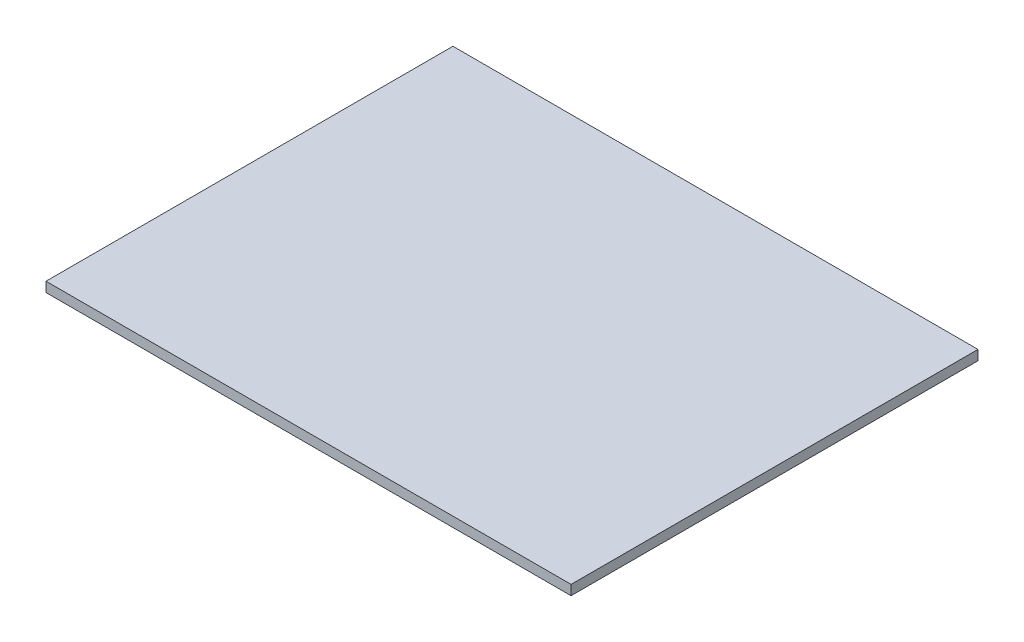
ISO-10303-21;
HEADER;
FILE_DESCRIPTION(('STEP AP214'),'2;1');
FILE_NAME('part.step','',(''),(''),'','','');
FILE_SCHEMA(('AUTOMOTIVE_DESIGN { 1 0 10303 214 1 1 1 1 }'));
ENDSEC;
DATA;
#1=APPLICATION_CONTEXT('core data for automotive mechanical design processes');
#2=APPLICATION_PROTOCOL_DEFINITION('international standard','automotive_design',2000,#1);
#3=PRODUCT_CONTEXT('',#1,'mechanical');
#4=PRODUCT('Part','Part','',(#3));
#5=PRODUCT_RELATED_PRODUCT_CATEGORY('part','',(#4));
#6=PRODUCT_DEFINITION_FORMATION('','',#4);
#7=PRODUCT_DEFINITION_CONTEXT('part definition',#1,'design');
#8=PRODUCT_DEFINITION('design','',#6,#7);
#9=PRODUCT_DEFINITION_SHAPE('','',#8);
#10=(LENGTH_UNIT() NAMED_UNIT(*) SI_UNIT(.MILLI.,.METRE.));
#11=(NAMED_UNIT(*) PLANE_ANGLE_UNIT() SI_UNIT($,.RADIAN.));
#12=(NAMED_UNIT(*) SI_UNIT($,.STERADIAN.) SOLID_ANGLE_UNIT());
#13=UNCERTAINTY_MEASURE_WITH_UNIT(LENGTH_MEASURE(1.E-05),#10,'distance_accuracy_value','');
#14=(GEOMETRIC_REPRESENTATION_CONTEXT(3) GLOBAL_UNCERTAINTY_ASSIGNED_CONTEXT((#13)) GLOBAL_UNIT_ASSIGNED_CONTEXT((#10,
#11,#12)) REPRESENTATION_CONTEXT('',''));
#15=CARTESIAN_POINT('',(0.,0.,0.));
#16=DIRECTION('',(0.,0.,1.));
#17=DIRECTION('',(1.,0.,0.));
#18=AXIS2_PLACEMENT_3D('',#15,#16,#17);
#19=CARTESIAN_POINT('',(-400.,15.,-620.));
#20=DIRECTION('',(1.,0.,0.));
#21=DIRECTION('',(0.,0.,-1.));
#22=AXIS2_PLACEMENT_3D('',#19,#20,#21);
#23=PLANE('',#22);
#24=DIRECTION('',(0.,0.,1.));
#25=VECTOR('',#24,1.);
#26=CARTESIAN_POINT('',(-400.,0.,-620.));
#27=LINE('',#26,#25);
#28=CARTESIAN_POINT('',(-400.,0.,-620.));
#29=VERTEX_POINT('',#28);
#30=CARTESIAN_POINT('',(-400.,0.,0.));
#31=VERTEX_POINT('',#30);
#32=EDGE_CURVE('E104',#29,#31,#27,.T.);
#33=ORIENTED_EDGE('',*,*,#32,.T.);
#34=DIRECTION('',(0.,-1.,0.));
#35=VECTOR('',#34,1.);
#36=CARTESIAN_POINT('',(-400.,15.,0.));
#37=LINE('',#36,#35);
#38=CARTESIAN_POINT('',(-400.,15.,0.));
#39=VERTEX_POINT('',#38);
#40=EDGE_CURVE('E11',#39,#31,#37,.T.);
#41=ORIENTED_EDGE('',*,*,#40,.F.);
#42=DIRECTION('',(0.,0.,1.));
#43=VECTOR('',#42,1.);
#44=CARTESIAN_POINT('',(-400.,15.,-620.));
#45=LINE('',#44,#43);
#46=CARTESIAN_POINT('',(-400.,15.,-620.));
#47=VERTEX_POINT('',#46);
#48=EDGE_CURVE('E92',#47,#39,#45,.T.);
#49=ORIENTED_EDGE('',*,*,#48,.F.);
#50=DIRECTION('',(0.,-1.,0.));
#51=VECTOR('',#50,1.);
#52=CARTESIAN_POINT('',(-400.,15.,-620.));
#53=LINE('',#52,#51);
#54=EDGE_CURVE('E100',#47,#29,#53,.T.);
#55=ORIENTED_EDGE('',*,*,#54,.T.);
#56=EDGE_LOOP('',(#33,#41,#49,#55));
#57=FACE_BOUND('',#56,.T.);
#58=ADVANCED_FACE('F41',(#57),#23,.F.);
#59=CARTESIAN_POINT('',(-400.,15.,0.));
#60=DIRECTION('',(0.,0.,-1.));
#61=DIRECTION('',(-1.,0.,0.));
#62=AXIS2_PLACEMENT_3D('',#59,#60,#61);
#63=PLANE('',#62);
#64=DIRECTION('',(1.,0.,0.));
#65=VECTOR('',#64,1.);
#66=CARTESIAN_POINT('',(-400.,0.,0.));
#67=LINE('',#66,#65);
#68=CARTESIAN_POINT('',(400.,0.,-1.46957615897682E-13));
#69=VERTEX_POINT('',#68);
#70=EDGE_CURVE('E96',#31,#69,#67,.T.);
#71=ORIENTED_EDGE('',*,*,#70,.T.);
#72=DIRECTION('',(0.,-1.,0.));
#73=VECTOR('',#72,1.);
#74=CARTESIAN_POINT('',(400.,15.,-1.46957615897682E-13));
#75=LINE('',#74,#73);
#76=CARTESIAN_POINT('',(400.,15.,-1.46957615897682E-13));
#77=VERTEX_POINT('',#76);
#78=EDGE_CURVE('E49',#77,#69,#75,.T.);
#79=ORIENTED_EDGE('',*,*,#78,.F.);
#80=DIRECTION('',(1.,0.,0.));
#81=VECTOR('',#80,1.);
#82=CARTESIAN_POINT('',(-400.,15.,0.));
#83=LINE('',#82,#81);
#84=EDGE_CURVE('E87',#39,#77,#83,.T.);
#85=ORIENTED_EDGE('',*,*,#84,.F.);
#86=ORIENTED_EDGE('',*,*,#40,.T.);
#87=EDGE_LOOP('',(#71,#79,#85,#86));
#88=FACE_BOUND('',#87,.T.);
#89=ADVANCED_FACE('F95',(#88),#63,.F.);
#90=CARTESIAN_POINT('',(400.,15.,-620.));
#91=DIRECTION('',(-1.,0.,0.));
#92=DIRECTION('',(0.,0.,1.));
#93=AXIS2_PLACEMENT_3D('',#90,#91,#92);
#94=PLANE('',#93);
#95=DIRECTION('',(0.,0.,-1.));
#96=VECTOR('',#95,1.);
#97=CARTESIAN_POINT('',(400.,0.,-620.));
#98=LINE('',#97,#96);
#99=CARTESIAN_POINT('',(400.,0.,-620.));
#100=VERTEX_POINT('',#99);
#101=EDGE_CURVE('E74',#69,#100,#98,.T.);
#102=ORIENTED_EDGE('',*,*,#101,.T.);
#103=DIRECTION('',(0.,-1.,0.));
#104=VECTOR('',#103,1.);
#105=CARTESIAN_POINT('',(400.,15.,-620.));
#106=LINE('',#105,#104);
#107=CARTESIAN_POINT('',(400.,15.,-620.));
#108=VERTEX_POINT('',#107);
#109=EDGE_CURVE('E97',#108,#100,#106,.T.);
#110=ORIENTED_EDGE('',*,*,#109,.F.);
#111=DIRECTION('',(0.,0.,-1.));
#112=VECTOR('',#111,1.);
#113=CARTESIAN_POINT('',(400.,15.,-620.));
#114=LINE('',#113,#112);
#115=EDGE_CURVE('E90',#77,#108,#114,.T.);
#116=ORIENTED_EDGE('',*,*,#115,.F.);
#117=ORIENTED_EDGE('',*,*,#78,.T.);
#118=EDGE_LOOP('',(#102,#110,#116,#117));
#119=FACE_BOUND('',#118,.T.);
#120=ADVANCED_FACE('F98',(#119),#94,.F.);
#121=CARTESIAN_POINT('',(-400.,15.,-620.));
#122=DIRECTION('',(0.,0.,1.));
#123=DIRECTION('',(1.,0.,0.));
#124=AXIS2_PLACEMENT_3D('',#121,#122,#123);
#125=PLANE('',#124);
#126=DIRECTION('',(-1.,0.,0.));
#127=VECTOR('',#126,1.);
#128=CARTESIAN_POINT('',(-400.,0.,-620.));
#129=LINE('',#128,#127);
#130=EDGE_CURVE('E80',#100,#29,#129,.T.);
#131=ORIENTED_EDGE('',*,*,#130,.T.);
#132=ORIENTED_EDGE('',*,*,#54,.F.);
#133=DIRECTION('',(-1.,0.,0.));
#134=VECTOR('',#133,1.);
#135=CARTESIAN_POINT('',(-400.,15.,-620.));
#136=LINE('',#135,#134);
#137=EDGE_CURVE('E57',#108,#47,#136,.T.);
#138=ORIENTED_EDGE('',*,*,#137,.F.);
#139=ORIENTED_EDGE('',*,*,#109,.T.);
#140=EDGE_LOOP('',(#131,#132,#138,#139));
#141=FACE_BOUND('',#140,.T.);
#142=ADVANCED_FACE('F111',(#141),#125,.F.);
#143=CARTESIAN_POINT('',(0.,15.,0.));
#144=DIRECTION('',(0.,1.,0.));
#145=DIRECTION('',(0.,0.,1.));
#146=AXIS2_PLACEMENT_3D('',#143,#144,#145);
#147=PLANE('',#146);
#148=ORIENTED_EDGE('',*,*,#48,.T.);
#149=ORIENTED_EDGE('',*,*,#84,.T.);
#150=ORIENTED_EDGE('',*,*,#115,.T.);
#151=ORIENTED_EDGE('',*,*,#137,.T.);
#152=EDGE_LOOP('',(#148,#149,#150,#151));
#153=FACE_BOUND('',#152,.T.);
#154=ADVANCED_FACE('F88',(#153),#147,.T.);
#155=CARTESIAN_POINT('',(0.,0.,0.));
#156=DIRECTION('',(0.,1.,0.));
#157=DIRECTION('',(0.,0.,1.));
#158=AXIS2_PLACEMENT_3D('',#155,#156,#157);
#159=PLANE('',#158);
#160=ORIENTED_EDGE('',*,*,#32,.F.);
#161=ORIENTED_EDGE('',*,*,#130,.F.);
#162=ORIENTED_EDGE('',*,*,#101,.F.);
#163=ORIENTED_EDGE('',*,*,#70,.F.);
#164=EDGE_LOOP('',(#160,#161,#162,#163));
#165=FACE_BOUND('',#164,.T.);
#166=ADVANCED_FACE('F114',(#165),#159,.F.);
#167=CLOSED_SHELL('',(#58,#89,#120,#142,#154,#166));
#168=MANIFOLD_SOLID_BREP('B2',#167);
#169=ADVANCED_BREP_SHAPE_REPRESENTATION('',(#18,#168),#14);
#170=SHAPE_DEFINITION_REPRESENTATION(#9,#169);
ENDSEC;
END-ISO-10303-21;
